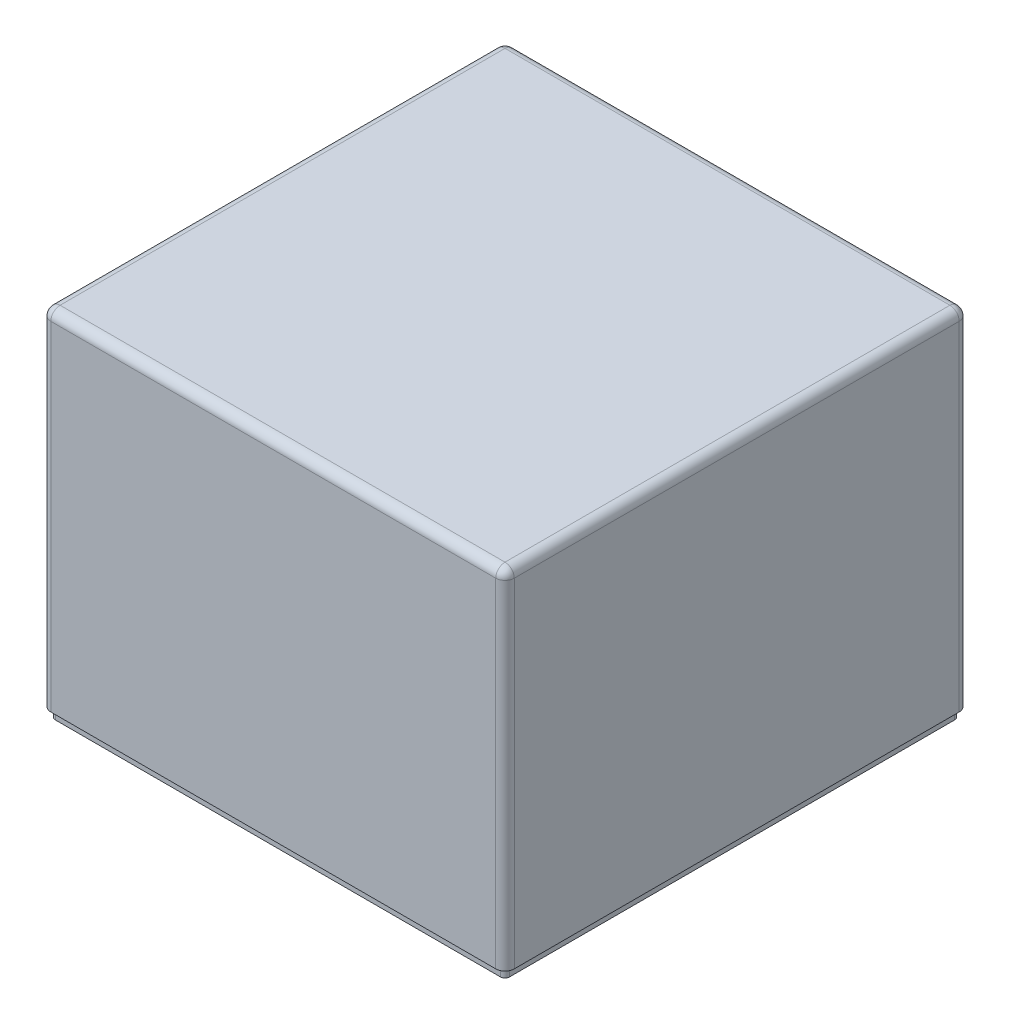
ISO-10303-21;
HEADER;
FILE_DESCRIPTION(('STEP AP214'),'2;1');
FILE_NAME('part.step','',(''),(''),'','','');
FILE_SCHEMA(('AUTOMOTIVE_DESIGN { 1 0 10303 214 1 1 1 1 }'));
ENDSEC;
DATA;
#1=APPLICATION_CONTEXT('core data for automotive mechanical design processes');
#2=APPLICATION_PROTOCOL_DEFINITION('international standard','automotive_design',2000,#1);
#3=PRODUCT_CONTEXT('',#1,'mechanical');
#4=PRODUCT('Part','Part','',(#3));
#5=PRODUCT_RELATED_PRODUCT_CATEGORY('part','',(#4));
#6=PRODUCT_DEFINITION_FORMATION('','',#4);
#7=PRODUCT_DEFINITION_CONTEXT('part definition',#1,'design');
#8=PRODUCT_DEFINITION('design','',#6,#7);
#9=PRODUCT_DEFINITION_SHAPE('','',#8);
#10=(LENGTH_UNIT() NAMED_UNIT(*) SI_UNIT(.MILLI.,.METRE.));
#11=(NAMED_UNIT(*) PLANE_ANGLE_UNIT() SI_UNIT($,.RADIAN.));
#12=(NAMED_UNIT(*) SI_UNIT($,.STERADIAN.) SOLID_ANGLE_UNIT());
#13=UNCERTAINTY_MEASURE_WITH_UNIT(LENGTH_MEASURE(1.E-05),#10,'distance_accuracy_value','');
#14=(GEOMETRIC_REPRESENTATION_CONTEXT(3) GLOBAL_UNCERTAINTY_ASSIGNED_CONTEXT((#13)) GLOBAL_UNIT_ASSIGNED_CONTEXT((#10,
#11,#12)) REPRESENTATION_CONTEXT('',''));
#15=CARTESIAN_POINT('',(0.,0.,0.));
#16=DIRECTION('',(0.,0.,1.));
#17=DIRECTION('',(1.,0.,0.));
#18=AXIS2_PLACEMENT_3D('',#15,#16,#17);
#19=CARTESIAN_POINT('',(0.,0.,0.));
#20=DIRECTION('',(0.,-1.,0.));
#21=DIRECTION('',(0.,0.,-1.));
#22=AXIS2_PLACEMENT_3D('',#19,#20,#21);
#23=PLANE('',#22);
#24=DIRECTION('',(0.,0.,-1.));
#25=VECTOR('',#24,1.);
#26=CARTESIAN_POINT('',(48.,0.,0.));
#27=LINE('',#26,#25);
#28=CARTESIAN_POINT('',(48.,0.,48.));
#29=VERTEX_POINT('',#28);
#30=CARTESIAN_POINT('',(48.,0.,-48.));
#31=VERTEX_POINT('',#30);
#32=EDGE_CURVE('E345',#29,#31,#27,.T.);
#33=ORIENTED_EDGE('',*,*,#32,.T.);
#34=DIRECTION('',(-1.,0.,0.));
#35=VECTOR('',#34,1.);
#36=CARTESIAN_POINT('',(0.,0.,-48.));
#37=LINE('',#36,#35);
#38=CARTESIAN_POINT('',(-48.,0.,-48.));
#39=VERTEX_POINT('',#38);
#40=EDGE_CURVE('E349',#31,#39,#37,.T.);
#41=ORIENTED_EDGE('',*,*,#40,.T.);
#42=DIRECTION('',(0.,0.,1.));
#43=VECTOR('',#42,1.);
#44=CARTESIAN_POINT('',(-48.,0.,0.));
#45=LINE('',#44,#43);
#46=CARTESIAN_POINT('',(-48.,0.,48.));
#47=VERTEX_POINT('',#46);
#48=EDGE_CURVE('E331',#39,#47,#45,.T.);
#49=ORIENTED_EDGE('',*,*,#48,.T.);
#50=DIRECTION('',(1.,0.,0.));
#51=VECTOR('',#50,1.);
#52=CARTESIAN_POINT('',(0.,0.,48.));
#53=LINE('',#52,#51);
#54=EDGE_CURVE('E309',#47,#29,#53,.T.);
#55=ORIENTED_EDGE('',*,*,#54,.T.);
#56=EDGE_LOOP('',(#33,#41,#49,#55));
#57=FACE_BOUND('',#56,.T.);
#58=DIRECTION('',(-1.,0.,0.));
#59=VECTOR('',#58,1.);
#60=CARTESIAN_POINT('',(48.,0.,49.));
#61=LINE('',#60,#59);
#62=CARTESIAN_POINT('',(48.,0.,49.));
#63=VERTEX_POINT('',#62);
#64=CARTESIAN_POINT('',(-48.,0.,49.));
#65=VERTEX_POINT('',#64);
#66=EDGE_CURVE('E218',#63,#65,#61,.T.);
#67=ORIENTED_EDGE('',*,*,#66,.T.);
#68=CARTESIAN_POINT('',(-48.,0.,48.));
#69=DIRECTION('',(0.,-1.,0.));
#70=DIRECTION('',(0.,0.,-1.));
#71=AXIS2_PLACEMENT_3D('',#68,#69,#70);
#72=CIRCLE('',#71,1.);
#73=CARTESIAN_POINT('',(-49.,0.,48.));
#74=VERTEX_POINT('',#73);
#75=EDGE_CURVE('E245',#65,#74,#72,.T.);
#76=ORIENTED_EDGE('',*,*,#75,.T.);
#77=DIRECTION('',(0.,0.,-1.));
#78=VECTOR('',#77,1.);
#79=CARTESIAN_POINT('',(-49.,0.,48.));
#80=LINE('',#79,#78);
#81=CARTESIAN_POINT('',(-49.,0.,-48.));
#82=VERTEX_POINT('',#81);
#83=EDGE_CURVE('E195',#74,#82,#80,.T.);
#84=ORIENTED_EDGE('',*,*,#83,.T.);
#85=CARTESIAN_POINT('',(-48.,0.,-48.));
#86=DIRECTION('',(0.,-1.,0.));
#87=DIRECTION('',(0.,0.,-1.));
#88=AXIS2_PLACEMENT_3D('',#85,#86,#87);
#89=CIRCLE('',#88,1.);
#90=CARTESIAN_POINT('',(-48.,0.,-49.));
#91=VERTEX_POINT('',#90);
#92=EDGE_CURVE('E55',#82,#91,#89,.T.);
#93=ORIENTED_EDGE('',*,*,#92,.T.);
#94=DIRECTION('',(1.,0.,0.));
#95=VECTOR('',#94,1.);
#96=CARTESIAN_POINT('',(-48.,0.,-49.));
#97=LINE('',#96,#95);
#98=CARTESIAN_POINT('',(48.,0.,-49.));
#99=VERTEX_POINT('',#98);
#100=EDGE_CURVE('E252',#91,#99,#97,.T.);
#101=ORIENTED_EDGE('',*,*,#100,.T.);
#102=CARTESIAN_POINT('',(48.,0.,-48.));
#103=DIRECTION('',(0.,-1.,0.));
#104=DIRECTION('',(0.,0.,-1.));
#105=AXIS2_PLACEMENT_3D('',#102,#103,#104);
#106=CIRCLE('',#105,1.);
#107=CARTESIAN_POINT('',(49.,0.,-48.));
#108=VERTEX_POINT('',#107);
#109=EDGE_CURVE('E256',#99,#108,#106,.T.);
#110=ORIENTED_EDGE('',*,*,#109,.T.);
#111=DIRECTION('',(0.,0.,1.));
#112=VECTOR('',#111,1.);
#113=CARTESIAN_POINT('',(49.,0.,-48.));
#114=LINE('',#113,#112);
#115=CARTESIAN_POINT('',(49.,0.,48.));
#116=VERTEX_POINT('',#115);
#117=EDGE_CURVE('E260',#108,#116,#114,.T.);
#118=ORIENTED_EDGE('',*,*,#117,.T.);
#119=CARTESIAN_POINT('',(48.,0.,48.));
#120=DIRECTION('',(0.,-1.,0.));
#121=DIRECTION('',(0.,0.,-1.));
#122=AXIS2_PLACEMENT_3D('',#119,#120,#121);
#123=CIRCLE('',#122,0.999999999999987);
#124=EDGE_CURVE('E222',#116,#63,#123,.T.);
#125=ORIENTED_EDGE('',*,*,#124,.T.);
#126=EDGE_LOOP('',(#67,#76,#84,#93,#101,#110,#118,#125));
#127=FACE_BOUND('',#126,.T.);
#128=ADVANCED_FACE('F39',(#57,#127),#23,.T.);
#129=CARTESIAN_POINT('',(50.,77.,48.));
#130=DIRECTION('',(0.,0.,-1.));
#131=DIRECTION('',(-1.,0.,0.));
#132=AXIS2_PLACEMENT_3D('',#129,#130,#131);
#133=PLANE('',#132);
#134=DIRECTION('',(-1.,0.,0.));
#135=VECTOR('',#134,1.);
#136=CARTESIAN_POINT('',(50.,75.,48.));
#137=LINE('',#136,#135);
#138=CARTESIAN_POINT('',(48.,75.,48.));
#139=VERTEX_POINT('',#138);
#140=CARTESIAN_POINT('',(-48.,75.,48.));
#141=VERTEX_POINT('',#140);
#142=EDGE_CURVE('E310',#139,#141,#137,.T.);
#143=ORIENTED_EDGE('',*,*,#142,.F.);
#144=DIRECTION('',(0.,1.,0.));
#145=VECTOR('',#144,1.);
#146=CARTESIAN_POINT('',(48.,77.,48.));
#147=LINE('',#146,#145);
#148=EDGE_CURVE('E315',#29,#139,#147,.T.);
#149=ORIENTED_EDGE('',*,*,#148,.F.);
#150=ORIENTED_EDGE('',*,*,#54,.F.);
#151=DIRECTION('',(0.,1.,0.));
#152=VECTOR('',#151,1.);
#153=CARTESIAN_POINT('',(-48.,77.,48.));
#154=LINE('',#153,#152);
#155=EDGE_CURVE('E316',#47,#141,#154,.T.);
#156=ORIENTED_EDGE('',*,*,#155,.T.);
#157=EDGE_LOOP('',(#143,#149,#150,#156));
#158=FACE_BOUND('',#157,.T.);
#159=ADVANCED_FACE('F525',(#158),#133,.T.);
#160=CARTESIAN_POINT('',(48.,77.,-50.));
#161=DIRECTION('',(-1.,0.,0.));
#162=DIRECTION('',(0.,0.,1.));
#163=AXIS2_PLACEMENT_3D('',#160,#161,#162);
#164=PLANE('',#163);
#165=ORIENTED_EDGE('',*,*,#32,.F.);
#166=ORIENTED_EDGE('',*,*,#148,.T.);
#167=DIRECTION('',(0.,0.,-1.));
#168=VECTOR('',#167,1.);
#169=CARTESIAN_POINT('',(48.,75.,0.));
#170=LINE('',#169,#168);
#171=CARTESIAN_POINT('',(48.,75.,-48.));
#172=VERTEX_POINT('',#171);
#173=EDGE_CURVE('E323',#139,#172,#170,.T.);
#174=ORIENTED_EDGE('',*,*,#173,.T.);
#175=DIRECTION('',(0.,1.,0.));
#176=VECTOR('',#175,1.);
#177=CARTESIAN_POINT('',(48.,77.,-48.));
#178=LINE('',#177,#176);
#179=EDGE_CURVE('E320',#31,#172,#178,.T.);
#180=ORIENTED_EDGE('',*,*,#179,.F.);
#181=EDGE_LOOP('',(#165,#166,#174,#180));
#182=FACE_BOUND('',#181,.T.);
#183=ADVANCED_FACE('F531',(#182),#164,.T.);
#184=CARTESIAN_POINT('',(-50.,77.,-48.));
#185=DIRECTION('',(0.,0.,1.));
#186=DIRECTION('',(1.,0.,0.));
#187=AXIS2_PLACEMENT_3D('',#184,#185,#186);
#188=PLANE('',#187);
#189=DIRECTION('',(-1.,0.,0.));
#190=VECTOR('',#189,1.);
#191=CARTESIAN_POINT('',(0.,75.,-48.));
#192=LINE('',#191,#190);
#193=CARTESIAN_POINT('',(-48.,75.,-48.));
#194=VERTEX_POINT('',#193);
#195=EDGE_CURVE('E332',#172,#194,#192,.T.);
#196=ORIENTED_EDGE('',*,*,#195,.T.);
#197=DIRECTION('',(0.,1.,0.));
#198=VECTOR('',#197,1.);
#199=CARTESIAN_POINT('',(-48.,77.,-48.));
#200=LINE('',#199,#198);
#201=EDGE_CURVE('E327',#39,#194,#200,.T.);
#202=ORIENTED_EDGE('',*,*,#201,.F.);
#203=ORIENTED_EDGE('',*,*,#40,.F.);
#204=ORIENTED_EDGE('',*,*,#179,.T.);
#205=EDGE_LOOP('',(#196,#202,#203,#204));
#206=FACE_BOUND('',#205,.T.);
#207=ADVANCED_FACE('F584',(#206),#188,.T.);
#208=CARTESIAN_POINT('',(-48.,77.,0.));
#209=DIRECTION('',(1.,0.,0.));
#210=DIRECTION('',(0.,0.,-1.));
#211=AXIS2_PLACEMENT_3D('',#208,#209,#210);
#212=PLANE('',#211);
#213=DIRECTION('',(0.,0.,-1.));
#214=VECTOR('',#213,1.);
#215=CARTESIAN_POINT('',(-48.,75.,0.));
#216=LINE('',#215,#214);
#217=EDGE_CURVE('E314',#141,#194,#216,.T.);
#218=ORIENTED_EDGE('',*,*,#217,.F.);
#219=ORIENTED_EDGE('',*,*,#155,.F.);
#220=ORIENTED_EDGE('',*,*,#48,.F.);
#221=ORIENTED_EDGE('',*,*,#201,.T.);
#222=EDGE_LOOP('',(#218,#219,#220,#221));
#223=FACE_BOUND('',#222,.T.);
#224=ADVANCED_FACE('F588',(#223),#212,.T.);
#225=CARTESIAN_POINT('',(0.,75.,0.));
#226=DIRECTION('',(0.,-1.,0.));
#227=DIRECTION('',(0.,0.,-1.));
#228=AXIS2_PLACEMENT_3D('',#225,#226,#227);
#229=PLANE('',#228);
#230=ORIENTED_EDGE('',*,*,#173,.F.);
#231=ORIENTED_EDGE('',*,*,#142,.T.);
#232=ORIENTED_EDGE('',*,*,#217,.T.);
#233=ORIENTED_EDGE('',*,*,#195,.F.);
#234=EDGE_LOOP('',(#230,#231,#232,#233));
#235=FACE_BOUND('',#234,.T.);
#236=ADVANCED_FACE('F580',(#235),#229,.T.);
#237=CARTESIAN_POINT('',(48.,2.,-48.));
#238=DIRECTION('',(0.,-1.,0.));
#239=DIRECTION('',(0.,0.,-1.));
#240=AXIS2_PLACEMENT_3D('',#237,#238,#239);
#241=PLANE('',#240);
#242=DIRECTION('',(-1.,0.,0.));
#243=VECTOR('',#242,1.);
#244=CARTESIAN_POINT('',(48.,2.,49.));
#245=LINE('',#244,#243);
#246=CARTESIAN_POINT('',(48.,2.,49.));
#247=VERTEX_POINT('',#246);
#248=CARTESIAN_POINT('',(-48.,2.,49.));
#249=VERTEX_POINT('',#248);
#250=EDGE_CURVE('E202',#247,#249,#245,.T.);
#251=ORIENTED_EDGE('',*,*,#250,.F.);
#252=CARTESIAN_POINT('',(48.,2.,48.));
#253=DIRECTION('',(0.,-1.,0.));
#254=DIRECTION('',(0.,0.,-1.));
#255=AXIS2_PLACEMENT_3D('',#252,#253,#254);
#256=CIRCLE('',#255,0.999999999999987);
#257=CARTESIAN_POINT('',(49.,2.,48.));
#258=VERTEX_POINT('',#257);
#259=EDGE_CURVE('E239',#258,#247,#256,.T.);
#260=ORIENTED_EDGE('',*,*,#259,.F.);
#261=DIRECTION('',(0.,0.,1.));
#262=VECTOR('',#261,1.);
#263=CARTESIAN_POINT('',(49.,2.,-48.));
#264=LINE('',#263,#262);
#265=CARTESIAN_POINT('',(49.,2.,-48.));
#266=VERTEX_POINT('',#265);
#267=EDGE_CURVE('E235',#266,#258,#264,.T.);
#268=ORIENTED_EDGE('',*,*,#267,.F.);
#269=CARTESIAN_POINT('',(48.,2.,-48.));
#270=DIRECTION('',(0.,-1.,0.));
#271=DIRECTION('',(0.,0.,-1.));
#272=AXIS2_PLACEMENT_3D('',#269,#270,#271);
#273=CIRCLE('',#272,1.);
#274=CARTESIAN_POINT('',(48.,2.,-49.));
#275=VERTEX_POINT('',#274);
#276=EDGE_CURVE('E231',#275,#266,#273,.T.);
#277=ORIENTED_EDGE('',*,*,#276,.F.);
#278=DIRECTION('',(1.,0.,0.));
#279=VECTOR('',#278,1.);
#280=CARTESIAN_POINT('',(-48.,2.,-49.));
#281=LINE('',#280,#279);
#282=CARTESIAN_POINT('',(-48.,2.,-49.));
#283=VERTEX_POINT('',#282);
#284=EDGE_CURVE('E227',#283,#275,#281,.T.);
#285=ORIENTED_EDGE('',*,*,#284,.F.);
#286=CARTESIAN_POINT('',(-48.,2.,-48.));
#287=DIRECTION('',(0.,-1.,0.));
#288=DIRECTION('',(0.,0.,-1.));
#289=AXIS2_PLACEMENT_3D('',#286,#287,#288);
#290=CIRCLE('',#289,1.);
#291=CARTESIAN_POINT('',(-49.,2.,-48.));
#292=VERTEX_POINT('',#291);
#293=EDGE_CURVE('E212',#292,#283,#290,.T.);
#294=ORIENTED_EDGE('',*,*,#293,.F.);
#295=DIRECTION('',(0.,0.,-1.));
#296=VECTOR('',#295,1.);
#297=CARTESIAN_POINT('',(-49.,2.,48.));
#298=LINE('',#297,#296);
#299=CARTESIAN_POINT('',(-49.,2.,48.));
#300=VERTEX_POINT('',#299);
#301=EDGE_CURVE('E193',#300,#292,#298,.T.);
#302=ORIENTED_EDGE('',*,*,#301,.F.);
#303=CARTESIAN_POINT('',(-48.,2.,48.));
#304=DIRECTION('',(0.,-1.,0.));
#305=DIRECTION('',(0.,0.,-1.));
#306=AXIS2_PLACEMENT_3D('',#303,#304,#305);
#307=CIRCLE('',#306,1.);
#308=EDGE_CURVE('E208',#249,#300,#307,.T.);
#309=ORIENTED_EDGE('',*,*,#308,.F.);
#310=EDGE_LOOP('',(#251,#260,#268,#277,#285,#294,#302,#309));
#311=FACE_BOUND('',#310,.T.);
#312=CARTESIAN_POINT('',(48.,2.,-48.));
#313=DIRECTION('',(0.,-1.,0.));
#314=DIRECTION('',(0.,0.,-1.));
#315=AXIS2_PLACEMENT_3D('',#312,#313,#314);
#316=CIRCLE('',#315,2.);
#317=CARTESIAN_POINT('',(48.,2.,-50.));
#318=VERTEX_POINT('',#317);
#319=CARTESIAN_POINT('',(50.,2.,-48.));
#320=VERTEX_POINT('',#319);
#321=EDGE_CURVE('E269',#318,#320,#316,.T.);
#322=ORIENTED_EDGE('',*,*,#321,.T.);
#323=DIRECTION('',(0.,0.,1.));
#324=VECTOR('',#323,1.);
#325=CARTESIAN_POINT('',(50.,2.,-48.));
#326=LINE('',#325,#324);
#327=CARTESIAN_POINT('',(50.,2.,48.));
#328=VERTEX_POINT('',#327);
#329=EDGE_CURVE('E289',#320,#328,#326,.T.);
#330=ORIENTED_EDGE('',*,*,#329,.T.);
#331=CARTESIAN_POINT('',(48.,2.,48.));
#332=DIRECTION('',(0.,-1.,0.));
#333=DIRECTION('',(0.,0.,-1.));
#334=AXIS2_PLACEMENT_3D('',#331,#332,#333);
#335=CIRCLE('',#334,1.99999999999999);
#336=CARTESIAN_POINT('',(48.,2.,50.));
#337=VERTEX_POINT('',#336);
#338=EDGE_CURVE('E292',#328,#337,#335,.T.);
#339=ORIENTED_EDGE('',*,*,#338,.T.);
#340=DIRECTION('',(-1.,0.,0.));
#341=VECTOR('',#340,1.);
#342=CARTESIAN_POINT('',(48.,2.,50.));
#343=LINE('',#342,#341);
#344=CARTESIAN_POINT('',(-48.,2.,50.));
#345=VERTEX_POINT('',#344);
#346=EDGE_CURVE('E295',#337,#345,#343,.T.);
#347=ORIENTED_EDGE('',*,*,#346,.T.);
#348=CARTESIAN_POINT('',(-48.,2.,48.));
#349=DIRECTION('',(0.,-1.,0.));
#350=DIRECTION('',(0.,0.,-1.));
#351=AXIS2_PLACEMENT_3D('',#348,#349,#350);
#352=CIRCLE('',#351,1.99999999999999);
#353=CARTESIAN_POINT('',(-50.,2.,48.));
#354=VERTEX_POINT('',#353);
#355=EDGE_CURVE('E63',#345,#354,#352,.T.);
#356=ORIENTED_EDGE('',*,*,#355,.T.);
#357=DIRECTION('',(0.,0.,-1.));
#358=VECTOR('',#357,1.);
#359=CARTESIAN_POINT('',(-50.,2.,48.));
#360=LINE('',#359,#358);
#361=CARTESIAN_POINT('',(-50.,2.,-48.));
#362=VERTEX_POINT('',#361);
#363=EDGE_CURVE('E300',#354,#362,#360,.T.);
#364=ORIENTED_EDGE('',*,*,#363,.T.);
#365=CARTESIAN_POINT('',(-48.,2.,-48.));
#366=DIRECTION('',(0.,-1.,0.));
#367=DIRECTION('',(0.,0.,-1.));
#368=AXIS2_PLACEMENT_3D('',#365,#366,#367);
#369=CIRCLE('',#368,2.);
#370=CARTESIAN_POINT('',(-48.,2.,-50.));
#371=VERTEX_POINT('',#370);
#372=EDGE_CURVE('E303',#362,#371,#369,.T.);
#373=ORIENTED_EDGE('',*,*,#372,.T.);
#374=DIRECTION('',(1.,0.,0.));
#375=VECTOR('',#374,1.);
#376=CARTESIAN_POINT('',(-48.,2.,-50.));
#377=LINE('',#376,#375);
#378=EDGE_CURVE('E306',#371,#318,#377,.T.);
#379=ORIENTED_EDGE('',*,*,#378,.T.);
#380=EDGE_LOOP('',(#322,#330,#339,#347,#356,#364,#373,#379));
#381=FACE_BOUND('',#380,.T.);
#382=ADVANCED_FACE('F207',(#311,#381),#241,.T.);
#383=CARTESIAN_POINT('',(-48.,2.,48.));
#384=DIRECTION('',(0.,-1.,0.));
#385=DIRECTION('',(0.,0.,-1.));
#386=AXIS2_PLACEMENT_3D('',#383,#384,#385);
#387=CYLINDRICAL_SURFACE('',#386,1.);
#388=ORIENTED_EDGE('',*,*,#75,.F.);
#389=DIRECTION('',(0.,-1.,0.));
#390=VECTOR('',#389,1.);
#391=CARTESIAN_POINT('',(-48.,2.,49.));
#392=LINE('',#391,#390);
#393=EDGE_CURVE('E216',#249,#65,#392,.T.);
#394=ORIENTED_EDGE('',*,*,#393,.F.);
#395=ORIENTED_EDGE('',*,*,#308,.T.);
#396=DIRECTION('',(0.,-1.,0.));
#397=VECTOR('',#396,1.);
#398=CARTESIAN_POINT('',(-49.,2.,48.));
#399=LINE('',#398,#397);
#400=EDGE_CURVE('E190',#300,#74,#399,.T.);
#401=ORIENTED_EDGE('',*,*,#400,.T.);
#402=EDGE_LOOP('',(#388,#394,#395,#401));
#403=FACE_BOUND('',#402,.T.);
#404=ADVANCED_FACE('F215',(#403),#387,.T.);
#405=CARTESIAN_POINT('',(48.,2.,49.));
#406=DIRECTION('',(0.,0.,1.));
#407=DIRECTION('',(1.,0.,0.));
#408=AXIS2_PLACEMENT_3D('',#405,#406,#407);
#409=PLANE('',#408);
#410=ORIENTED_EDGE('',*,*,#66,.F.);
#411=DIRECTION('',(0.,-1.,0.));
#412=VECTOR('',#411,1.);
#413=CARTESIAN_POINT('',(48.,2.,49.));
#414=LINE('',#413,#412);
#415=EDGE_CURVE('E270',#247,#63,#414,.T.);
#416=ORIENTED_EDGE('',*,*,#415,.F.);
#417=ORIENTED_EDGE('',*,*,#250,.T.);
#418=ORIENTED_EDGE('',*,*,#393,.T.);
#419=EDGE_LOOP('',(#410,#416,#417,#418));
#420=FACE_BOUND('',#419,.T.);
#421=ADVANCED_FACE('F578',(#420),#409,.T.);
#422=CARTESIAN_POINT('',(48.,2.,48.));
#423=DIRECTION('',(0.,-1.,0.));
#424=DIRECTION('',(0.,0.,-1.));
#425=AXIS2_PLACEMENT_3D('',#422,#423,#424);
#426=CYLINDRICAL_SURFACE('',#425,0.999999999999987);
#427=ORIENTED_EDGE('',*,*,#124,.F.);
#428=DIRECTION('',(0.,-1.,0.));
#429=VECTOR('',#428,1.);
#430=CARTESIAN_POINT('',(49.,2.,48.));
#431=LINE('',#430,#429);
#432=EDGE_CURVE('E273',#258,#116,#431,.T.);
#433=ORIENTED_EDGE('',*,*,#432,.F.);
#434=ORIENTED_EDGE('',*,*,#259,.T.);
#435=ORIENTED_EDGE('',*,*,#415,.T.);
#436=EDGE_LOOP('',(#427,#433,#434,#435));
#437=FACE_BOUND('',#436,.T.);
#438=ADVANCED_FACE('F618',(#437),#426,.T.);
#439=CARTESIAN_POINT('',(49.,2.,-48.));
#440=DIRECTION('',(1.,0.,0.));
#441=DIRECTION('',(0.,0.,-1.));
#442=AXIS2_PLACEMENT_3D('',#439,#440,#441);
#443=PLANE('',#442);
#444=ORIENTED_EDGE('',*,*,#117,.F.);
#445=DIRECTION('',(0.,-1.,0.));
#446=VECTOR('',#445,1.);
#447=CARTESIAN_POINT('',(49.,2.,-48.));
#448=LINE('',#447,#446);
#449=EDGE_CURVE('E276',#266,#108,#448,.T.);
#450=ORIENTED_EDGE('',*,*,#449,.F.);
#451=ORIENTED_EDGE('',*,*,#267,.T.);
#452=ORIENTED_EDGE('',*,*,#432,.T.);
#453=EDGE_LOOP('',(#444,#450,#451,#452));
#454=FACE_BOUND('',#453,.T.);
#455=ADVANCED_FACE('F626',(#454),#443,.T.);
#456=CARTESIAN_POINT('',(48.,2.,-48.));
#457=DIRECTION('',(0.,-1.,0.));
#458=DIRECTION('',(0.,0.,-1.));
#459=AXIS2_PLACEMENT_3D('',#456,#457,#458);
#460=CYLINDRICAL_SURFACE('',#459,1.);
#461=ORIENTED_EDGE('',*,*,#109,.F.);
#462=DIRECTION('',(0.,-1.,0.));
#463=VECTOR('',#462,1.);
#464=CARTESIAN_POINT('',(48.,2.,-49.));
#465=LINE('',#464,#463);
#466=EDGE_CURVE('E279',#275,#99,#465,.T.);
#467=ORIENTED_EDGE('',*,*,#466,.F.);
#468=ORIENTED_EDGE('',*,*,#276,.T.);
#469=ORIENTED_EDGE('',*,*,#449,.T.);
#470=EDGE_LOOP('',(#461,#467,#468,#469));
#471=FACE_BOUND('',#470,.T.);
#472=ADVANCED_FACE('F634',(#471),#460,.T.);
#473=CARTESIAN_POINT('',(-48.,2.,-49.));
#474=DIRECTION('',(0.,0.,-1.));
#475=DIRECTION('',(-1.,0.,0.));
#476=AXIS2_PLACEMENT_3D('',#473,#474,#475);
#477=PLANE('',#476);
#478=ORIENTED_EDGE('',*,*,#100,.F.);
#479=DIRECTION('',(0.,-1.,0.));
#480=VECTOR('',#479,1.);
#481=CARTESIAN_POINT('',(-48.,2.,-49.));
#482=LINE('',#481,#480);
#483=EDGE_CURVE('E282',#283,#91,#482,.T.);
#484=ORIENTED_EDGE('',*,*,#483,.F.);
#485=ORIENTED_EDGE('',*,*,#284,.T.);
#486=ORIENTED_EDGE('',*,*,#466,.T.);
#487=EDGE_LOOP('',(#478,#484,#485,#486));
#488=FACE_BOUND('',#487,.T.);
#489=ADVANCED_FACE('F572',(#488),#477,.T.);
#490=CARTESIAN_POINT('',(-48.,2.,-48.));
#491=DIRECTION('',(0.,-1.,0.));
#492=DIRECTION('',(0.,0.,-1.));
#493=AXIS2_PLACEMENT_3D('',#490,#491,#492);
#494=CYLINDRICAL_SURFACE('',#493,1.);
#495=ORIENTED_EDGE('',*,*,#92,.F.);
#496=DIRECTION('',(0.,-1.,0.));
#497=VECTOR('',#496,1.);
#498=CARTESIAN_POINT('',(-49.,2.,-48.));
#499=LINE('',#498,#497);
#500=EDGE_CURVE('E201',#292,#82,#499,.T.);
#501=ORIENTED_EDGE('',*,*,#500,.F.);
#502=ORIENTED_EDGE('',*,*,#293,.T.);
#503=ORIENTED_EDGE('',*,*,#483,.T.);
#504=EDGE_LOOP('',(#495,#501,#502,#503));
#505=FACE_BOUND('',#504,.T.);
#506=ADVANCED_FACE('F567',(#505),#494,.T.);
#507=CARTESIAN_POINT('',(-49.,2.,48.));
#508=DIRECTION('',(-1.,0.,0.));
#509=DIRECTION('',(0.,0.,1.));
#510=AXIS2_PLACEMENT_3D('',#507,#508,#509);
#511=PLANE('',#510);
#512=ORIENTED_EDGE('',*,*,#83,.F.);
#513=ORIENTED_EDGE('',*,*,#400,.F.);
#514=ORIENTED_EDGE('',*,*,#301,.T.);
#515=ORIENTED_EDGE('',*,*,#500,.T.);
#516=EDGE_LOOP('',(#512,#513,#514,#515));
#517=FACE_BOUND('',#516,.T.);
#518=ADVANCED_FACE('F192',(#517),#511,.T.);
#519=CARTESIAN_POINT('',(0.,77.,0.));
#520=DIRECTION('',(0.,-1.,0.));
#521=DIRECTION('',(0.,0.,-1.));
#522=AXIS2_PLACEMENT_3D('',#519,#520,#521);
#523=PLANE('',#522);
#524=DIRECTION('',(0.,0.,-1.));
#525=VECTOR('',#524,1.);
#526=CARTESIAN_POINT('',(48.,77.,0.));
#527=LINE('',#526,#525);
#528=CARTESIAN_POINT('',(48.,77.,48.));
#529=VERTEX_POINT('',#528);
#530=CARTESIAN_POINT('',(48.,77.,-48.));
#531=VERTEX_POINT('',#530);
#532=EDGE_CURVE('E336',#529,#531,#527,.T.);
#533=ORIENTED_EDGE('',*,*,#532,.T.);
#534=DIRECTION('',(-1.,0.,0.));
#535=VECTOR('',#534,1.);
#536=CARTESIAN_POINT('',(0.,77.,-48.));
#537=LINE('',#536,#535);
#538=CARTESIAN_POINT('',(-48.,77.,-48.));
#539=VERTEX_POINT('',#538);
#540=EDGE_CURVE('E431',#531,#539,#537,.T.);
#541=ORIENTED_EDGE('',*,*,#540,.T.);
#542=DIRECTION('',(0.,0.,-1.));
#543=VECTOR('',#542,1.);
#544=CARTESIAN_POINT('',(-48.,77.,0.));
#545=LINE('',#544,#543);
#546=CARTESIAN_POINT('',(-48.,77.,48.));
#547=VERTEX_POINT('',#546);
#548=EDGE_CURVE('E403',#539,#547,#545,.F.);
#549=ORIENTED_EDGE('',*,*,#548,.T.);
#550=DIRECTION('',(1.,0.,0.));
#551=VECTOR('',#550,1.);
#552=CARTESIAN_POINT('',(0.,77.,48.));
#553=LINE('',#552,#551);
#554=EDGE_CURVE('E362',#547,#529,#553,.T.);
#555=ORIENTED_EDGE('',*,*,#554,.T.);
#556=EDGE_LOOP('',(#533,#541,#549,#555));
#557=FACE_BOUND('',#556,.T.);
#558=ADVANCED_FACE('F492',(#557),#523,.F.);
#559=CARTESIAN_POINT('',(48.,75.,-48.));
#560=DIRECTION('',(0.,0.,1.));
#561=DIRECTION('',(1.,0.,0.));
#562=AXIS2_PLACEMENT_3D('',#559,#560,#561);
#563=SPHERICAL_SURFACE('',#562,2.);
#564=CARTESIAN_POINT('',(48.,75.,-48.));
#565=DIRECTION('',(-1.,0.,0.));
#566=DIRECTION('',(0.,0.,1.));
#567=AXIS2_PLACEMENT_3D('',#564,#565,#566);
#568=CIRCLE('',#567,2.);
#569=CARTESIAN_POINT('',(48.,75.,-50.));
#570=VERTEX_POINT('',#569);
#571=EDGE_CURVE('E447',#531,#570,#568,.T.);
#572=ORIENTED_EDGE('',*,*,#571,.F.);
#573=CARTESIAN_POINT('',(48.,75.,-48.));
#574=DIRECTION('',(0.,0.,-1.));
#575=DIRECTION('',(-1.,0.,0.));
#576=AXIS2_PLACEMENT_3D('',#573,#574,#575);
#577=CIRCLE('',#576,2.);
#578=CARTESIAN_POINT('',(50.,75.,-48.));
#579=VERTEX_POINT('',#578);
#580=EDGE_CURVE('E427',#579,#531,#577,.F.);
#581=ORIENTED_EDGE('',*,*,#580,.F.);
#582=CARTESIAN_POINT('',(48.,75.,-48.));
#583=DIRECTION('',(0.,1.,0.));
#584=DIRECTION('',(0.,0.,1.));
#585=AXIS2_PLACEMENT_3D('',#582,#583,#584);
#586=CIRCLE('',#585,2.);
#587=EDGE_CURVE('E443',#579,#570,#586,.T.);
#588=ORIENTED_EDGE('',*,*,#587,.T.);
#589=EDGE_LOOP('',(#572,#581,#588));
#590=FACE_BOUND('',#589,.T.);
#591=ADVANCED_FACE('F499',(#590),#563,.T.);
#592=CARTESIAN_POINT('',(-48.,75.,-48.));
#593=DIRECTION('',(0.,0.,1.));
#594=DIRECTION('',(1.,0.,0.));
#595=AXIS2_PLACEMENT_3D('',#592,#593,#594);
#596=SPHERICAL_SURFACE('',#595,2.);
#597=CARTESIAN_POINT('',(-48.,75.,-48.));
#598=DIRECTION('',(0.,-1.,0.));
#599=DIRECTION('',(0.,0.,-1.));
#600=AXIS2_PLACEMENT_3D('',#597,#598,#599);
#601=CIRCLE('',#600,2.);
#602=CARTESIAN_POINT('',(-50.,75.,-48.));
#603=VERTEX_POINT('',#602);
#604=CARTESIAN_POINT('',(-48.,75.,-50.));
#605=VERTEX_POINT('',#604);
#606=EDGE_CURVE('E11',#603,#605,#601,.T.);
#607=ORIENTED_EDGE('',*,*,#606,.F.);
#608=CARTESIAN_POINT('',(-48.,75.,-48.));
#609=DIRECTION('',(0.,0.,-1.));
#610=DIRECTION('',(-1.,0.,0.));
#611=AXIS2_PLACEMENT_3D('',#608,#609,#610);
#612=CIRCLE('',#611,2.);
#613=EDGE_CURVE('E435',#539,#603,#612,.F.);
#614=ORIENTED_EDGE('',*,*,#613,.F.);
#615=CARTESIAN_POINT('',(-48.,75.,-48.));
#616=DIRECTION('',(-1.,0.,0.));
#617=DIRECTION('',(0.,0.,1.));
#618=AXIS2_PLACEMENT_3D('',#615,#616,#617);
#619=CIRCLE('',#618,2.);
#620=EDGE_CURVE('E48',#539,#605,#619,.T.);
#621=ORIENTED_EDGE('',*,*,#620,.T.);
#622=EDGE_LOOP('',(#607,#614,#621));
#623=FACE_BOUND('',#622,.T.);
#624=ADVANCED_FACE('F454',(#623),#596,.T.);
#625=CARTESIAN_POINT('',(-48.,75.,48.));
#626=DIRECTION('',(1.,0.,0.));
#627=DIRECTION('',(0.,0.,-1.));
#628=AXIS2_PLACEMENT_3D('',#625,#626,#627);
#629=SPHERICAL_SURFACE('',#628,2.);
#630=CARTESIAN_POINT('',(-48.,75.,48.));
#631=DIRECTION('',(0.,0.,-1.));
#632=DIRECTION('',(-1.,0.,0.));
#633=AXIS2_PLACEMENT_3D('',#630,#631,#632);
#634=CIRCLE('',#633,2.);
#635=CARTESIAN_POINT('',(-50.,75.,48.));
#636=VERTEX_POINT('',#635);
#637=EDGE_CURVE('E409',#636,#547,#634,.T.);
#638=ORIENTED_EDGE('',*,*,#637,.F.);
#639=CARTESIAN_POINT('',(-48.,75.,48.));
#640=DIRECTION('',(0.,1.,0.));
#641=DIRECTION('',(0.,0.,1.));
#642=AXIS2_PLACEMENT_3D('',#639,#640,#641);
#643=CIRCLE('',#642,2.);
#644=CARTESIAN_POINT('',(-48.,75.,50.));
#645=VERTEX_POINT('',#644);
#646=EDGE_CURVE('E406',#636,#645,#643,.T.);
#647=ORIENTED_EDGE('',*,*,#646,.T.);
#648=CARTESIAN_POINT('',(-48.,75.,48.));
#649=DIRECTION('',(1.,0.,0.));
#650=DIRECTION('',(0.,0.,-1.));
#651=AXIS2_PLACEMENT_3D('',#648,#649,#650);
#652=CIRCLE('',#651,2.);
#653=EDGE_CURVE('E399',#547,#645,#652,.T.);
#654=ORIENTED_EDGE('',*,*,#653,.F.);
#655=EDGE_LOOP('',(#638,#647,#654));
#656=FACE_BOUND('',#655,.T.);
#657=ADVANCED_FACE('F478',(#656),#629,.T.);
#658=CARTESIAN_POINT('',(48.,75.,48.));
#659=DIRECTION('',(0.,0.,-1.));
#660=DIRECTION('',(-1.,0.,0.));
#661=AXIS2_PLACEMENT_3D('',#658,#659,#660);
#662=SPHERICAL_SURFACE('',#661,2.);
#663=CARTESIAN_POINT('',(48.,75.,48.));
#664=DIRECTION('',(0.,-1.,0.));
#665=DIRECTION('',(0.,0.,-1.));
#666=AXIS2_PLACEMENT_3D('',#663,#664,#665);
#667=CIRCLE('',#666,2.);
#668=CARTESIAN_POINT('',(50.,75.,48.));
#669=VERTEX_POINT('',#668);
#670=CARTESIAN_POINT('',(48.,75.,50.));
#671=VERTEX_POINT('',#670);
#672=EDGE_CURVE('E384',#669,#671,#667,.T.);
#673=ORIENTED_EDGE('',*,*,#672,.F.);
#674=CARTESIAN_POINT('',(48.,75.,48.));
#675=DIRECTION('',(0.,0.,-1.));
#676=DIRECTION('',(-1.,0.,0.));
#677=AXIS2_PLACEMENT_3D('',#674,#675,#676);
#678=CIRCLE('',#677,2.);
#679=EDGE_CURVE('E372',#529,#669,#678,.T.);
#680=ORIENTED_EDGE('',*,*,#679,.F.);
#681=CARTESIAN_POINT('',(48.,75.,48.));
#682=DIRECTION('',(1.,0.,0.));
#683=DIRECTION('',(0.,0.,-1.));
#684=AXIS2_PLACEMENT_3D('',#681,#682,#683);
#685=CIRCLE('',#684,2.);
#686=EDGE_CURVE('E380',#529,#671,#685,.T.);
#687=ORIENTED_EDGE('',*,*,#686,.T.);
#688=EDGE_LOOP('',(#673,#680,#687));
#689=FACE_BOUND('',#688,.T.);
#690=ADVANCED_FACE('F514',(#689),#662,.T.);
#691=CARTESIAN_POINT('',(0.,75.,48.));
#692=DIRECTION('',(1.,0.,0.));
#693=DIRECTION('',(0.,0.,-1.));
#694=AXIS2_PLACEMENT_3D('',#691,#692,#693);
#695=CYLINDRICAL_SURFACE('',#694,2.);
#696=ORIENTED_EDGE('',*,*,#554,.F.);
#697=ORIENTED_EDGE('',*,*,#653,.T.);
#698=DIRECTION('',(1.,0.,0.));
#699=VECTOR('',#698,1.);
#700=CARTESIAN_POINT('',(50.,75.,50.));
#701=LINE('',#700,#699);
#702=EDGE_CURVE('E368',#671,#645,#701,.F.);
#703=ORIENTED_EDGE('',*,*,#702,.F.);
#704=ORIENTED_EDGE('',*,*,#686,.F.);
#705=EDGE_LOOP('',(#696,#697,#703,#704));
#706=FACE_BOUND('',#705,.T.);
#707=ADVANCED_FACE('F489',(#706),#695,.T.);
#708=CARTESIAN_POINT('',(48.,75.,0.));
#709=DIRECTION('',(0.,0.,-1.));
#710=DIRECTION('',(-1.,0.,0.));
#711=AXIS2_PLACEMENT_3D('',#708,#709,#710);
#712=CYLINDRICAL_SURFACE('',#711,2.);
#713=DIRECTION('',(0.,0.,-1.));
#714=VECTOR('',#713,1.);
#715=CARTESIAN_POINT('',(50.,75.,-50.));
#716=LINE('',#715,#714);
#717=EDGE_CURVE('E359',#579,#669,#716,.F.);
#718=ORIENTED_EDGE('',*,*,#717,.F.);
#719=ORIENTED_EDGE('',*,*,#580,.T.);
#720=ORIENTED_EDGE('',*,*,#532,.F.);
#721=ORIENTED_EDGE('',*,*,#679,.T.);
#722=EDGE_LOOP('',(#718,#719,#720,#721));
#723=FACE_BOUND('',#722,.T.);
#724=ADVANCED_FACE('F497',(#723),#712,.T.);
#725=CARTESIAN_POINT('',(0.,75.,-48.));
#726=DIRECTION('',(-1.,0.,0.));
#727=DIRECTION('',(0.,0.,1.));
#728=AXIS2_PLACEMENT_3D('',#725,#726,#727);
#729=CYLINDRICAL_SURFACE('',#728,2.);
#730=ORIENTED_EDGE('',*,*,#620,.F.);
#731=ORIENTED_EDGE('',*,*,#540,.F.);
#732=ORIENTED_EDGE('',*,*,#571,.T.);
#733=DIRECTION('',(-1.,0.,0.));
#734=VECTOR('',#733,1.);
#735=CARTESIAN_POINT('',(-50.,75.,-50.));
#736=LINE('',#735,#734);
#737=EDGE_CURVE('E419',#605,#570,#736,.F.);
#738=ORIENTED_EDGE('',*,*,#737,.F.);
#739=EDGE_LOOP('',(#730,#731,#732,#738));
#740=FACE_BOUND('',#739,.T.);
#741=ADVANCED_FACE('F458',(#740),#729,.T.);
#742=CARTESIAN_POINT('',(-48.,75.,0.));
#743=DIRECTION('',(0.,0.,-1.));
#744=DIRECTION('',(-1.,0.,0.));
#745=AXIS2_PLACEMENT_3D('',#742,#743,#744);
#746=CYLINDRICAL_SURFACE('',#745,2.);
#747=ORIENTED_EDGE('',*,*,#548,.F.);
#748=ORIENTED_EDGE('',*,*,#613,.T.);
#749=DIRECTION('',(0.,0.,-1.));
#750=VECTOR('',#749,1.);
#751=CARTESIAN_POINT('',(-50.,75.,0.));
#752=LINE('',#751,#750);
#753=EDGE_CURVE('E388',#636,#603,#752,.T.);
#754=ORIENTED_EDGE('',*,*,#753,.F.);
#755=ORIENTED_EDGE('',*,*,#637,.T.);
#756=EDGE_LOOP('',(#747,#748,#754,#755));
#757=FACE_BOUND('',#756,.T.);
#758=ADVANCED_FACE('F470',(#757),#746,.T.);
#759=CARTESIAN_POINT('',(50.,77.,-50.));
#760=DIRECTION('',(-1.,0.,0.));
#761=DIRECTION('',(0.,0.,1.));
#762=AXIS2_PLACEMENT_3D('',#759,#760,#761);
#763=PLANE('',#762);
#764=ORIENTED_EDGE('',*,*,#329,.F.);
#765=DIRECTION('',(0.,1.,0.));
#766=VECTOR('',#765,1.);
#767=CARTESIAN_POINT('',(50.,77.,-48.));
#768=LINE('',#767,#766);
#769=EDGE_CURVE('E413',#320,#579,#768,.T.);
#770=ORIENTED_EDGE('',*,*,#769,.T.);
#771=ORIENTED_EDGE('',*,*,#717,.T.);
#772=DIRECTION('',(0.,-1.,0.));
#773=VECTOR('',#772,1.);
#774=CARTESIAN_POINT('',(50.,77.,48.));
#775=LINE('',#774,#773);
#776=EDGE_CURVE('E376',#669,#328,#775,.T.);
#777=ORIENTED_EDGE('',*,*,#776,.T.);
#778=EDGE_LOOP('',(#764,#770,#771,#777));
#779=FACE_BOUND('',#778,.T.);
#780=ADVANCED_FACE('F508',(#779),#763,.F.);
#781=CARTESIAN_POINT('',(50.,77.,50.));
#782=DIRECTION('',(0.,0.,-1.));
#783=DIRECTION('',(-1.,0.,0.));
#784=AXIS2_PLACEMENT_3D('',#781,#782,#783);
#785=PLANE('',#784);
#786=ORIENTED_EDGE('',*,*,#346,.F.);
#787=DIRECTION('',(0.,-1.,0.));
#788=VECTOR('',#787,1.);
#789=CARTESIAN_POINT('',(48.,77.,50.));
#790=LINE('',#789,#788);
#791=EDGE_CURVE('E365',#337,#671,#790,.F.);
#792=ORIENTED_EDGE('',*,*,#791,.T.);
#793=ORIENTED_EDGE('',*,*,#702,.T.);
#794=DIRECTION('',(0.,1.,0.));
#795=VECTOR('',#794,1.);
#796=CARTESIAN_POINT('',(-48.,77.,50.));
#797=LINE('',#796,#795);
#798=EDGE_CURVE('E395',#645,#345,#797,.F.);
#799=ORIENTED_EDGE('',*,*,#798,.T.);
#800=EDGE_LOOP('',(#786,#792,#793,#799));
#801=FACE_BOUND('',#800,.T.);
#802=ADVANCED_FACE('F485',(#801),#785,.F.);
#803=CARTESIAN_POINT('',(48.,77.,48.));
#804=DIRECTION('',(0.,-1.,0.));
#805=DIRECTION('',(0.,0.,-1.));
#806=AXIS2_PLACEMENT_3D('',#803,#804,#805);
#807=CYLINDRICAL_SURFACE('',#806,2.);
#808=ORIENTED_EDGE('',*,*,#791,.F.);
#809=ORIENTED_EDGE('',*,*,#338,.F.);
#810=ORIENTED_EDGE('',*,*,#776,.F.);
#811=ORIENTED_EDGE('',*,*,#672,.T.);
#812=EDGE_LOOP('',(#808,#809,#810,#811));
#813=FACE_BOUND('',#812,.T.);
#814=ADVANCED_FACE('F512',(#813),#807,.T.);
#815=CARTESIAN_POINT('',(-50.,77.,0.));
#816=DIRECTION('',(1.,0.,0.));
#817=DIRECTION('',(0.,0.,-1.));
#818=AXIS2_PLACEMENT_3D('',#815,#816,#817);
#819=PLANE('',#818);
#820=ORIENTED_EDGE('',*,*,#363,.F.);
#821=DIRECTION('',(0.,1.,0.));
#822=VECTOR('',#821,1.);
#823=CARTESIAN_POINT('',(-50.,77.,48.));
#824=LINE('',#823,#822);
#825=EDGE_CURVE('E392',#354,#636,#824,.T.);
#826=ORIENTED_EDGE('',*,*,#825,.T.);
#827=ORIENTED_EDGE('',*,*,#753,.T.);
#828=DIRECTION('',(0.,-1.,0.));
#829=VECTOR('',#828,1.);
#830=CARTESIAN_POINT('',(-50.,77.,-48.));
#831=LINE('',#830,#829);
#832=EDGE_CURVE('E439',#603,#362,#831,.T.);
#833=ORIENTED_EDGE('',*,*,#832,.T.);
#834=EDGE_LOOP('',(#820,#826,#827,#833));
#835=FACE_BOUND('',#834,.T.);
#836=ADVANCED_FACE('F471',(#835),#819,.F.);
#837=CARTESIAN_POINT('',(-48.,77.,48.));
#838=DIRECTION('',(0.,1.,0.));
#839=DIRECTION('',(0.,0.,1.));
#840=AXIS2_PLACEMENT_3D('',#837,#838,#839);
#841=CYLINDRICAL_SURFACE('',#840,2.);
#842=ORIENTED_EDGE('',*,*,#825,.F.);
#843=ORIENTED_EDGE('',*,*,#355,.F.);
#844=ORIENTED_EDGE('',*,*,#798,.F.);
#845=ORIENTED_EDGE('',*,*,#646,.F.);
#846=EDGE_LOOP('',(#842,#843,#844,#845));
#847=FACE_BOUND('',#846,.T.);
#848=ADVANCED_FACE('F481',(#847),#841,.T.);
#849=CARTESIAN_POINT('',(-50.,77.,-50.));
#850=DIRECTION('',(0.,0.,1.));
#851=DIRECTION('',(1.,0.,0.));
#852=AXIS2_PLACEMENT_3D('',#849,#850,#851);
#853=PLANE('',#852);
#854=ORIENTED_EDGE('',*,*,#378,.F.);
#855=DIRECTION('',(0.,-1.,0.));
#856=VECTOR('',#855,1.);
#857=CARTESIAN_POINT('',(-48.,77.,-50.));
#858=LINE('',#857,#856);
#859=EDGE_CURVE('E416',#371,#605,#858,.F.);
#860=ORIENTED_EDGE('',*,*,#859,.T.);
#861=ORIENTED_EDGE('',*,*,#737,.T.);
#862=DIRECTION('',(0.,1.,0.));
#863=VECTOR('',#862,1.);
#864=CARTESIAN_POINT('',(48.,77.,-50.));
#865=LINE('',#864,#863);
#866=EDGE_CURVE('E423',#570,#318,#865,.F.);
#867=ORIENTED_EDGE('',*,*,#866,.T.);
#868=EDGE_LOOP('',(#854,#860,#861,#867));
#869=FACE_BOUND('',#868,.T.);
#870=ADVANCED_FACE('F461',(#869),#853,.F.);
#871=CARTESIAN_POINT('',(-48.,77.,-48.));
#872=DIRECTION('',(0.,-1.,0.));
#873=DIRECTION('',(0.,0.,-1.));
#874=AXIS2_PLACEMENT_3D('',#871,#872,#873);
#875=CYLINDRICAL_SURFACE('',#874,2.);
#876=ORIENTED_EDGE('',*,*,#859,.F.);
#877=ORIENTED_EDGE('',*,*,#372,.F.);
#878=ORIENTED_EDGE('',*,*,#832,.F.);
#879=ORIENTED_EDGE('',*,*,#606,.T.);
#880=EDGE_LOOP('',(#876,#877,#878,#879));
#881=FACE_BOUND('',#880,.T.);
#882=ADVANCED_FACE('F41',(#881),#875,.T.);
#883=CARTESIAN_POINT('',(48.,77.,-48.));
#884=DIRECTION('',(0.,1.,0.));
#885=DIRECTION('',(0.,0.,1.));
#886=AXIS2_PLACEMENT_3D('',#883,#884,#885);
#887=CYLINDRICAL_SURFACE('',#886,2.);
#888=ORIENTED_EDGE('',*,*,#769,.F.);
#889=ORIENTED_EDGE('',*,*,#321,.F.);
#890=ORIENTED_EDGE('',*,*,#866,.F.);
#891=ORIENTED_EDGE('',*,*,#587,.F.);
#892=EDGE_LOOP('',(#888,#889,#890,#891));
#893=FACE_BOUND('',#892,.T.);
#894=ADVANCED_FACE('F504',(#893),#887,.T.);
#895=CLOSED_SHELL('',(#128,#159,#183,#207,#224,#236,#382,#404,#421,#438,#455,#472,#489,#506,
#518,#558,#591,#624,#657,#690,#707,#724,#741,#758,#780,#802,#814,#836,#848,#870,#882,#894));
#896=MANIFOLD_SOLID_BREP('B2',#895);
#897=ADVANCED_BREP_SHAPE_REPRESENTATION('',(#18,#896),#14);
#898=SHAPE_DEFINITION_REPRESENTATION(#9,#897);
ENDSEC;
END-ISO-10303-21;
